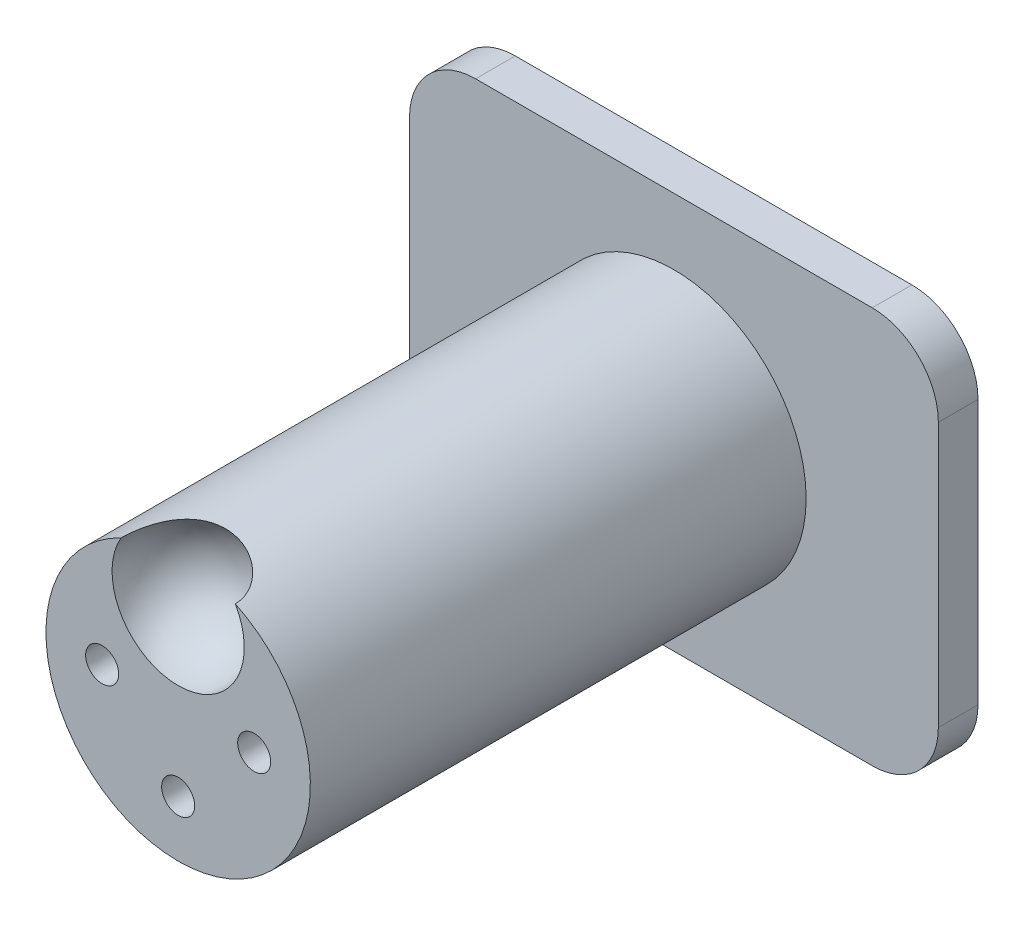
ISO-10303-21;
HEADER;
FILE_DESCRIPTION(('STEP AP214'),'2;1');
FILE_NAME('part.step','',(''),(''),'','','');
FILE_SCHEMA(('AUTOMOTIVE_DESIGN { 1 0 10303 214 1 1 1 1 }'));
ENDSEC;
DATA;
#1=APPLICATION_CONTEXT('core data for automotive mechanical design processes');
#2=APPLICATION_PROTOCOL_DEFINITION('international standard','automotive_design',2000,#1);
#3=PRODUCT_CONTEXT('',#1,'mechanical');
#4=PRODUCT('Part','Part','',(#3));
#5=PRODUCT_RELATED_PRODUCT_CATEGORY('part','',(#4));
#6=PRODUCT_DEFINITION_FORMATION('','',#4);
#7=PRODUCT_DEFINITION_CONTEXT('part definition',#1,'design');
#8=PRODUCT_DEFINITION('design','',#6,#7);
#9=PRODUCT_DEFINITION_SHAPE('','',#8);
#10=(LENGTH_UNIT() NAMED_UNIT(*) SI_UNIT(.MILLI.,.METRE.));
#11=(NAMED_UNIT(*) PLANE_ANGLE_UNIT() SI_UNIT($,.RADIAN.));
#12=(NAMED_UNIT(*) SI_UNIT($,.STERADIAN.) SOLID_ANGLE_UNIT());
#13=UNCERTAINTY_MEASURE_WITH_UNIT(LENGTH_MEASURE(1.E-05),#10,'distance_accuracy_value','');
#14=(GEOMETRIC_REPRESENTATION_CONTEXT(3) GLOBAL_UNCERTAINTY_ASSIGNED_CONTEXT((#13)) GLOBAL_UNIT_ASSIGNED_CONTEXT((#10,
#11,#12)) REPRESENTATION_CONTEXT('',''));
#15=CARTESIAN_POINT('',(0.,0.,0.));
#16=DIRECTION('',(0.,0.,1.));
#17=DIRECTION('',(1.,0.,0.));
#18=AXIS2_PLACEMENT_3D('',#15,#16,#17);
#19=CARTESIAN_POINT('',(0.,0.,6.));
#20=DIRECTION('',(0.,0.,1.));
#21=DIRECTION('',(1.,0.,0.));
#22=AXIS2_PLACEMENT_3D('',#19,#20,#21);
#23=PLANE('',#22);
#24=DIRECTION('',(0.,-1.,0.));
#25=VECTOR('',#24,1.);
#26=CARTESIAN_POINT('',(-49.9578316000514,-35.,6.));
#27=LINE('',#26,#25);
#28=CARTESIAN_POINT('',(-49.9578316000514,15.,6.));
#29=VERTEX_POINT('',#28);
#30=CARTESIAN_POINT('',(-49.9578316000514,-25.,6.));
#31=VERTEX_POINT('',#30);
#32=EDGE_CURVE('E132',#29,#31,#27,.T.);
#33=ORIENTED_EDGE('',*,*,#32,.T.);
#34=CARTESIAN_POINT('',(-39.9578316000514,-25.,6.));
#35=DIRECTION('',(0.,0.,1.));
#36=DIRECTION('',(1.,0.,0.));
#37=AXIS2_PLACEMENT_3D('',#34,#35,#36);
#38=CIRCLE('',#37,10.);
#39=CARTESIAN_POINT('',(-39.9578316000514,-35.,6.));
#40=VERTEX_POINT('',#39);
#41=EDGE_CURVE('E168',#31,#40,#38,.T.);
#42=ORIENTED_EDGE('',*,*,#41,.T.);
#43=DIRECTION('',(1.,0.,0.));
#44=VECTOR('',#43,1.);
#45=CARTESIAN_POINT('',(30.0421683999486,-35.,6.));
#46=LINE('',#45,#44);
#47=CARTESIAN_POINT('',(20.0421683999486,-35.,6.));
#48=VERTEX_POINT('',#47);
#49=EDGE_CURVE('E135',#40,#48,#46,.T.);
#50=ORIENTED_EDGE('',*,*,#49,.T.);
#51=CARTESIAN_POINT('',(20.0421683999486,-25.,6.));
#52=DIRECTION('',(0.,0.,1.));
#53=DIRECTION('',(1.,0.,0.));
#54=AXIS2_PLACEMENT_3D('',#51,#52,#53);
#55=CIRCLE('',#54,10.);
#56=CARTESIAN_POINT('',(30.0421683999486,-25.,6.));
#57=VERTEX_POINT('',#56);
#58=EDGE_CURVE('E166',#48,#57,#55,.T.);
#59=ORIENTED_EDGE('',*,*,#58,.T.);
#60=DIRECTION('',(0.,1.,0.));
#61=VECTOR('',#60,1.);
#62=CARTESIAN_POINT('',(30.0421683999486,-35.,6.));
#63=LINE('',#62,#61);
#64=CARTESIAN_POINT('',(30.0421683999486,15.,6.));
#65=VERTEX_POINT('',#64);
#66=EDGE_CURVE('E126',#57,#65,#63,.T.);
#67=ORIENTED_EDGE('',*,*,#66,.T.);
#68=CARTESIAN_POINT('',(20.0421683999486,15.,6.));
#69=DIRECTION('',(0.,0.,1.));
#70=DIRECTION('',(1.,0.,0.));
#71=AXIS2_PLACEMENT_3D('',#68,#69,#70);
#72=CIRCLE('',#71,10.);
#73=CARTESIAN_POINT('',(20.0421683999486,25.,6.));
#74=VERTEX_POINT('',#73);
#75=EDGE_CURVE('E162',#65,#74,#72,.T.);
#76=ORIENTED_EDGE('',*,*,#75,.T.);
#77=DIRECTION('',(-1.,0.,0.));
#78=VECTOR('',#77,1.);
#79=CARTESIAN_POINT('',(30.0421683999486,25.,6.));
#80=LINE('',#79,#78);
#81=CARTESIAN_POINT('',(-39.9578316000514,25.,6.));
#82=VERTEX_POINT('',#81);
#83=EDGE_CURVE('E129',#74,#82,#80,.T.);
#84=ORIENTED_EDGE('',*,*,#83,.T.);
#85=CARTESIAN_POINT('',(-39.9578316000514,15.,6.));
#86=DIRECTION('',(0.,0.,1.));
#87=DIRECTION('',(1.,0.,0.));
#88=AXIS2_PLACEMENT_3D('',#85,#86,#87);
#89=CIRCLE('',#88,10.);
#90=EDGE_CURVE('E164',#82,#29,#89,.T.);
#91=ORIENTED_EDGE('',*,*,#90,.T.);
#92=EDGE_LOOP('',(#33,#42,#50,#59,#67,#76,#84,#91));
#93=FACE_BOUND('',#92,.T.);
#94=CARTESIAN_POINT('',(-9.95783160005139,-5.,6.));
#95=DIRECTION('',(0.,0.,1.));
#96=DIRECTION('',(1.,0.,0.));
#97=AXIS2_PLACEMENT_3D('',#94,#95,#96);
#98=CIRCLE('',#97,20.);
#99=CARTESIAN_POINT('',(10.0421683999486,-5.,6.));
#100=VERTEX_POINT('',#99);
#101=EDGE_CURVE('E114',#100,#100,#98,.T.);
#102=ORIENTED_EDGE('',*,*,#101,.F.);
#103=EDGE_LOOP('',(#102));
#104=FACE_BOUND('',#103,.T.);
#105=ADVANCED_FACE('F33',(#93,#104),#23,.T.);
#106=CARTESIAN_POINT('',(30.0421683999486,-35.,6.));
#107=DIRECTION('',(-1.,0.,0.));
#108=DIRECTION('',(0.,0.,1.));
#109=AXIS2_PLACEMENT_3D('',#106,#107,#108);
#110=PLANE('',#109);
#111=ORIENTED_EDGE('',*,*,#66,.F.);
#112=DIRECTION('',(0.,0.,-1.));
#113=VECTOR('',#112,1.);
#114=CARTESIAN_POINT('',(30.0421683999486,-25.,6.));
#115=LINE('',#114,#113);
#116=CARTESIAN_POINT('',(30.0421683999486,-25.,0.));
#117=VERTEX_POINT('',#116);
#118=EDGE_CURVE('E172',#57,#117,#115,.T.);
#119=ORIENTED_EDGE('',*,*,#118,.T.);
#120=DIRECTION('',(0.,1.,0.));
#121=VECTOR('',#120,1.);
#122=CARTESIAN_POINT('',(30.0421683999486,-35.,0.));
#123=LINE('',#122,#121);
#124=CARTESIAN_POINT('',(30.0421683999486,15.,0.));
#125=VERTEX_POINT('',#124);
#126=EDGE_CURVE('E113',#117,#125,#123,.T.);
#127=ORIENTED_EDGE('',*,*,#126,.T.);
#128=DIRECTION('',(0.,0.,-1.));
#129=VECTOR('',#128,1.);
#130=CARTESIAN_POINT('',(30.0421683999486,15.,6.));
#131=LINE('',#130,#129);
#132=EDGE_CURVE('E170',#125,#65,#131,.F.);
#133=ORIENTED_EDGE('',*,*,#132,.T.);
#134=EDGE_LOOP('',(#111,#119,#127,#133));
#135=FACE_BOUND('',#134,.T.);
#136=ADVANCED_FACE('F211',(#135),#110,.F.);
#137=CARTESIAN_POINT('',(30.0421683999486,25.,6.));
#138=DIRECTION('',(0.,-1.,0.));
#139=DIRECTION('',(1.,0.,0.));
#140=AXIS2_PLACEMENT_3D('',#137,#138,#139);
#141=PLANE('',#140);
#142=DIRECTION('',(-1.,0.,0.));
#143=VECTOR('',#142,1.);
#144=CARTESIAN_POINT('',(30.0421683999486,25.,0.));
#145=LINE('',#144,#143);
#146=CARTESIAN_POINT('',(20.0421683999486,25.,0.));
#147=VERTEX_POINT('',#146);
#148=CARTESIAN_POINT('',(-39.9578316000514,25.,0.));
#149=VERTEX_POINT('',#148);
#150=EDGE_CURVE('E117',#147,#149,#145,.T.);
#151=ORIENTED_EDGE('',*,*,#150,.T.);
#152=DIRECTION('',(0.,0.,-1.));
#153=VECTOR('',#152,1.);
#154=CARTESIAN_POINT('',(-39.9578316000514,25.,6.));
#155=LINE('',#154,#153);
#156=EDGE_CURVE('E41',#149,#82,#155,.F.);
#157=ORIENTED_EDGE('',*,*,#156,.T.);
#158=ORIENTED_EDGE('',*,*,#83,.F.);
#159=DIRECTION('',(0.,0.,-1.));
#160=VECTOR('',#159,1.);
#161=CARTESIAN_POINT('',(20.0421683999486,25.,6.));
#162=LINE('',#161,#160);
#163=EDGE_CURVE('E175',#74,#147,#162,.T.);
#164=ORIENTED_EDGE('',*,*,#163,.T.);
#165=EDGE_LOOP('',(#151,#157,#158,#164));
#166=FACE_BOUND('',#165,.T.);
#167=ADVANCED_FACE('F179',(#166),#141,.F.);
#168=CARTESIAN_POINT('',(-49.9578316000514,-35.,6.));
#169=DIRECTION('',(1.,0.,0.));
#170=DIRECTION('',(0.,0.,-1.));
#171=AXIS2_PLACEMENT_3D('',#168,#169,#170);
#172=PLANE('',#171);
#173=DIRECTION('',(0.,-1.,0.));
#174=VECTOR('',#173,1.);
#175=CARTESIAN_POINT('',(-49.9578316000514,-35.,0.));
#176=LINE('',#175,#174);
#177=CARTESIAN_POINT('',(-49.9578316000514,15.,0.));
#178=VERTEX_POINT('',#177);
#179=CARTESIAN_POINT('',(-49.9578316000514,-25.,0.));
#180=VERTEX_POINT('',#179);
#181=EDGE_CURVE('E140',#178,#180,#176,.T.);
#182=ORIENTED_EDGE('',*,*,#181,.T.);
#183=DIRECTION('',(0.,0.,-1.));
#184=VECTOR('',#183,1.);
#185=CARTESIAN_POINT('',(-49.9578316000514,-25.,6.));
#186=LINE('',#185,#184);
#187=EDGE_CURVE('E160',#180,#31,#186,.F.);
#188=ORIENTED_EDGE('',*,*,#187,.T.);
#189=ORIENTED_EDGE('',*,*,#32,.F.);
#190=DIRECTION('',(0.,0.,-1.));
#191=VECTOR('',#190,1.);
#192=CARTESIAN_POINT('',(-49.9578316000514,15.,6.));
#193=LINE('',#192,#191);
#194=EDGE_CURVE('E157',#29,#178,#193,.T.);
#195=ORIENTED_EDGE('',*,*,#194,.T.);
#196=EDGE_LOOP('',(#182,#188,#189,#195));
#197=FACE_BOUND('',#196,.T.);
#198=ADVANCED_FACE('F193',(#197),#172,.F.);
#199=CARTESIAN_POINT('',(30.0421683999486,-35.,6.));
#200=DIRECTION('',(0.,1.,0.));
#201=DIRECTION('',(-1.,0.,0.));
#202=AXIS2_PLACEMENT_3D('',#199,#200,#201);
#203=PLANE('',#202);
#204=ORIENTED_EDGE('',*,*,#49,.F.);
#205=DIRECTION('',(0.,0.,-1.));
#206=VECTOR('',#205,1.);
#207=CARTESIAN_POINT('',(-39.9578316000514,-35.,6.));
#208=LINE('',#207,#206);
#209=CARTESIAN_POINT('',(-39.9578316000514,-35.,0.));
#210=VERTEX_POINT('',#209);
#211=EDGE_CURVE('E146',#40,#210,#208,.T.);
#212=ORIENTED_EDGE('',*,*,#211,.T.);
#213=DIRECTION('',(1.,0.,0.));
#214=VECTOR('',#213,1.);
#215=CARTESIAN_POINT('',(30.0421683999486,-35.,0.));
#216=LINE('',#215,#214);
#217=CARTESIAN_POINT('',(20.0421683999486,-35.,0.));
#218=VERTEX_POINT('',#217);
#219=EDGE_CURVE('E130',#210,#218,#216,.T.);
#220=ORIENTED_EDGE('',*,*,#219,.T.);
#221=DIRECTION('',(0.,0.,-1.));
#222=VECTOR('',#221,1.);
#223=CARTESIAN_POINT('',(20.0421683999486,-35.,6.));
#224=LINE('',#223,#222);
#225=EDGE_CURVE('E137',#218,#48,#224,.F.);
#226=ORIENTED_EDGE('',*,*,#225,.T.);
#227=EDGE_LOOP('',(#204,#212,#220,#226));
#228=FACE_BOUND('',#227,.T.);
#229=ADVANCED_FACE('F203',(#228),#203,.F.);
#230=CARTESIAN_POINT('',(0.,0.,0.));
#231=DIRECTION('',(0.,0.,1.));
#232=DIRECTION('',(1.,0.,0.));
#233=AXIS2_PLACEMENT_3D('',#230,#231,#232);
#234=PLANE('',#233);
#235=ORIENTED_EDGE('',*,*,#219,.F.);
#236=CARTESIAN_POINT('',(-39.9578316000514,-25.,0.));
#237=DIRECTION('',(0.,0.,1.));
#238=DIRECTION('',(1.,0.,0.));
#239=AXIS2_PLACEMENT_3D('',#236,#237,#238);
#240=CIRCLE('',#239,10.);
#241=EDGE_CURVE('E155',#210,#180,#240,.F.);
#242=ORIENTED_EDGE('',*,*,#241,.T.);
#243=ORIENTED_EDGE('',*,*,#181,.F.);
#244=CARTESIAN_POINT('',(-39.9578316000514,15.,0.));
#245=DIRECTION('',(0.,0.,1.));
#246=DIRECTION('',(1.,0.,0.));
#247=AXIS2_PLACEMENT_3D('',#244,#245,#246);
#248=CIRCLE('',#247,10.);
#249=EDGE_CURVE('E151',#178,#149,#248,.F.);
#250=ORIENTED_EDGE('',*,*,#249,.T.);
#251=ORIENTED_EDGE('',*,*,#150,.F.);
#252=CARTESIAN_POINT('',(20.0421683999486,15.,0.));
#253=DIRECTION('',(0.,0.,1.));
#254=DIRECTION('',(1.,0.,0.));
#255=AXIS2_PLACEMENT_3D('',#252,#253,#254);
#256=CIRCLE('',#255,10.);
#257=EDGE_CURVE('E149',#147,#125,#256,.F.);
#258=ORIENTED_EDGE('',*,*,#257,.T.);
#259=ORIENTED_EDGE('',*,*,#126,.F.);
#260=CARTESIAN_POINT('',(20.0421683999486,-25.,0.));
#261=DIRECTION('',(0.,0.,1.));
#262=DIRECTION('',(1.,0.,0.));
#263=AXIS2_PLACEMENT_3D('',#260,#261,#262);
#264=CIRCLE('',#263,10.);
#265=EDGE_CURVE('E153',#117,#218,#264,.F.);
#266=ORIENTED_EDGE('',*,*,#265,.T.);
#267=EDGE_LOOP('',(#235,#242,#243,#250,#251,#258,#259,#266));
#268=FACE_BOUND('',#267,.T.);
#269=ADVANCED_FACE('F184',(#268),#234,.F.);
#270=CARTESIAN_POINT('',(-9.95783160005139,-5.,81.));
#271=DIRECTION('',(0.,0.,-1.));
#272=DIRECTION('',(-1.,0.,0.));
#273=AXIS2_PLACEMENT_3D('',#270,#271,#272);
#274=CYLINDRICAL_SURFACE('',#273,20.);
#275=CARTESIAN_POINT('',(-9.95783160005139,-5.,81.));
#276=DIRECTION('',(0.,0.,1.));
#277=DIRECTION('',(1.,0.,0.));
#278=AXIS2_PLACEMENT_3D('',#275,#276,#277);
#279=CIRCLE('',#278,20.);
#280=CARTESIAN_POINT('',(-18.5957656890245,13.0384615384615,81.));
#281=VERTEX_POINT('',#280);
#282=CARTESIAN_POINT('',(-1.31989751107828,13.0384615384615,81.));
#283=VERTEX_POINT('',#282);
#284=EDGE_CURVE('E108',#281,#283,#279,.T.);
#285=ORIENTED_EDGE('',*,*,#284,.F.);
#286=CARTESIAN_POINT('',(-18.5957656858118,13.03846154,81.0002));
#287=CARTESIAN_POINT('',(-18.5958194261612,13.0384088876324,80.8176301358421));
#288=CARTESIAN_POINT('',(-18.5877484361733,13.0423000992443,80.6350890562003));
#289=CARTESIAN_POINT('',(-18.5557193538504,13.0575994662564,80.2718519671144));
#290=CARTESIAN_POINT('',(-18.5317727438403,13.0690021887846,80.0911547199265));
#291=CARTESIAN_POINT('',(-18.46859529565,13.0988407355018,79.7344873649878));
#292=CARTESIAN_POINT('',(-18.4294822316351,13.1172223431727,79.5584917388694));
#293=CARTESIAN_POINT('',(-18.3365894712036,13.160370373185,79.2112108681918));
#294=CARTESIAN_POINT('',(-18.2828080390031,13.1851375511449,79.0399261837451));
#295=CARTESIAN_POINT('',(-18.1615220009078,13.2401719548513,78.7037732576968));
#296=CARTESIAN_POINT('',(-18.094056209218,13.2704235992871,78.5388884055078));
#297=CARTESIAN_POINT('',(-17.9461496574339,13.3355748681974,78.2159309188068));
#298=CARTESIAN_POINT('',(-17.8657030776999,13.3704765761925,78.057861380253));
#299=CARTESIAN_POINT('',(-17.6926731449617,13.4439978770986,77.7491852361011));
#300=CARTESIAN_POINT('',(-17.6000762550616,13.4826216038433,77.5985872164464));
#301=CARTESIAN_POINT('',(-17.4037392810013,13.5625894106956,77.3055708485906));
#302=CARTESIAN_POINT('',(-17.2999948354673,13.6039345530619,77.1631557355616));
#303=CARTESIAN_POINT('',(-16.9673373376582,13.7329716883214,76.7411430842849));
#304=CARTESIAN_POINT('',(-16.7218247308537,13.8235487763619,76.4753003334698));
#305=CARTESIAN_POINT('',(-16.1951213848917,14.0045709566868,75.9820466730398));
#306=CARTESIAN_POINT('',(-15.9139271728562,14.0950160352549,75.7546395093781));
#307=CARTESIAN_POINT('',(-15.4424850530064,14.2341455506596,75.422993837292));
#308=CARTESIAN_POINT('',(-15.261531081201,14.2849068014069,75.3061744055309));
#309=CARTESIAN_POINT('',(-14.890578832197,14.383105284505,75.0862147949806));
#310=CARTESIAN_POINT('',(-14.7005796515428,14.4305421836376,74.9830759865541));
#311=CARTESIAN_POINT('',(-14.3127048653205,14.5211366814866,74.7904240648905));
#312=CARTESIAN_POINT('',(-14.1148252922161,14.5642920854335,74.7009179275458));
#313=CARTESIAN_POINT('',(-13.7124281481726,14.6454865401959,74.5355211064414));
#314=CARTESIAN_POINT('',(-13.5079100171116,14.6835251578872,74.4596315751149));
#315=CARTESIAN_POINT('',(-13.0649783283015,14.7586119046287,74.3119437285131));
#316=CARTESIAN_POINT('',(-12.8257574829266,14.7948115322718,74.2421277896061));
#317=CARTESIAN_POINT('',(-12.3418062633731,14.8589088563032,74.1199302759572));
#318=CARTESIAN_POINT('',(-12.0970754244312,14.8868058495278,74.0675501778409));
#319=CARTESIAN_POINT('',(-11.6036270434215,14.9337099399935,73.9801445984421));
#320=CARTESIAN_POINT('',(-11.3549084575052,14.9527146689281,73.9451237403567));
#321=CARTESIAN_POINT('',(-10.8551126047026,14.981430144763,73.8924071841464));
#322=CARTESIAN_POINT('',(-10.6040353026801,14.9911407529926,73.8747117445212));
#323=CARTESIAN_POINT('',(-10.0851154994406,15.0013831618722,73.8560470352191));
#324=CARTESIAN_POINT('',(-9.81721915773107,15.0012940953999,73.8562091473641));
#325=CARTESIAN_POINT('',(-9.2823625047952,14.9903801746893,73.8760979050308));
#326=CARTESIAN_POINT('',(-9.0154022432386,14.9795547591636,73.8958255734235));
#327=CARTESIAN_POINT('',(-8.48420406326268,14.9474119311848,73.9548893598652));
#328=CARTESIAN_POINT('',(-8.21996706694684,14.9260910768775,73.9942319104355));
#329=CARTESIAN_POINT('',(-7.69619279893093,14.8734563210459,74.0925921511112));
#330=CARTESIAN_POINT('',(-7.43665543893219,14.8421426074778,74.1516094711539));
#331=CARTESIAN_POINT('',(-6.92223783186849,14.7700059298632,74.2899347078282));
#332=CARTESIAN_POINT('',(-6.66740782928526,14.7291126517695,74.3693931073246));
#333=CARTESIAN_POINT('',(-6.16643000886042,14.6389930880622,74.5485008513994));
#334=CARTESIAN_POINT('',(-5.9202828183326,14.589766201848,74.6481516513402));
#335=CARTESIAN_POINT('',(-5.43887152285187,14.4843448712801,74.8677073768211));
#336=CARTESIAN_POINT('',(-5.20360263424318,14.4281535302859,74.9876032897125));
#337=CARTESIAN_POINT('',(-4.74603619726877,14.3104365098641,75.2477597804707));
#338=CARTESIAN_POINT('',(-4.52373562236321,14.2489120834694,75.3880155798854));
#339=CARTESIAN_POINT('',(-4.13750482180554,14.1351987297124,75.658688848966));
#340=CARTESIAN_POINT('',(-3.97081289312756,14.0836138292746,75.7854330306658));
#341=CARTESIAN_POINT('',(-3.64845073158019,13.9794727177815,76.0518655348456));
#342=CARTESIAN_POINT('',(-3.49277860200088,13.926916675851,76.1915516201835));
#343=CARTESIAN_POINT('',(-3.19390822338057,13.822178466678,76.4835919503343));
#344=CARTESIAN_POINT('',(-3.05070004956742,13.7699960328987,76.6359359234475));
#345=CARTESIAN_POINT('',(-2.77806469208348,13.6674089495916,76.9530558674581));
#346=CARTESIAN_POINT('',(-2.64863531405245,13.6170040178432,77.1178298516346));
#347=CARTESIAN_POINT('',(-2.42540840202565,13.527669963821,77.4307367556257));
#348=CARTESIAN_POINT('',(-2.32926939541967,13.4882296935293,77.5770564402104));
#349=CARTESIAN_POINT('',(-2.14851492723567,13.4126089930049,77.8774403932647));
#350=CARTESIAN_POINT('',(-2.06389732325082,13.3764279571417,78.0315032145818));
#351=CARTESIAN_POINT('',(-1.90719014939606,13.3083168950122,78.3465102706415));
#352=CARTESIAN_POINT('',(-1.83508318585757,13.2763809814035,78.5074445573809));
#353=CARTESIAN_POINT('',(-1.70415961064343,13.2176302364179,78.8354551268329));
#354=CARTESIAN_POINT('',(-1.64533562236817,13.190812563952,79.0025279403208));
#355=CARTESIAN_POINT('',(-1.54875117640676,13.1463439298861,79.3187950384542));
#356=CARTESIAN_POINT('',(-1.50921655007586,13.1279432272217,79.4673439190129));
#357=CARTESIAN_POINT('',(-1.4410721457492,13.0960276754116,79.767427891617));
#358=CARTESIAN_POINT('',(-1.41246049638479,13.0825119893662,79.9189624674587));
#359=CARTESIAN_POINT('',(-1.36638482958895,13.0606681911252,80.2248668926261));
#360=CARTESIAN_POINT('',(-1.34897696258672,13.0523662136261,80.379247094865));
#361=CARTESIAN_POINT('',(-1.32571523706444,13.0412470555497,80.6891466651436));
#362=CARTESIAN_POINT('',(-1.31986711077293,13.0384325961249,80.8446665599875));
#363=CARTESIAN_POINT('',(-1.31989751429102,13.03846154,81.0002));
#364=B_SPLINE_CURVE_WITH_KNOTS('',3,(#286,#287,#288,#289,#290,#291,#292,#293,#294,#295,#296,
#297,#298,#299,#300,#301,#302,#303,#304,#305,#306,#307,#308,#309,#310,#311,#312,#313,#314,#315,
#316,#317,#318,#319,#320,#321,#322,#323,#324,#325,#326,#327,#328,#329,#330,#331,#332,#333,#334,
#335,#336,#337,#338,#339,#340,#341,#342,#343,#344,#345,#346,#347,#348,#349,#350,#351,#352,#353,
#354,#355,#356,#357,#358,#359,#360,#361,#362,#363),.UNSPECIFIED.,.F.,.F.,(4,2,2,2,2,2,2,2,2,2,2,
2,2,2,2,2,2,2,2,2,2,2,2,2,2,2,2,2,2,2,2,2,2,2,2,2,2,2,4),(0.,0.547443834171983,1.09449215118353,
1.63737482997188,2.18032177877009,2.72174972767707,3.26342109133575,3.80570114850077,
4.34819414538649,5.46291979354796,6.57775402090519,7.24104528154342,7.90440293274831,
8.56809889449772,9.23185100127791,9.98647068851285,10.7411542675492,11.4960387297363,
12.2509344548212,13.0536831975525,13.8564739095307,14.6595280627216,15.4625671121183,
16.2716961398314,17.0808835060775,17.8897115862849,18.698350141077,19.3447250793084,
19.9909884926579,20.6367325004943,21.2823735151913,21.820244438746,22.3580152081171,
22.8950322114736,23.4317502490191,23.8957342540432,24.3596387317373,24.8258504364257,
25.2922932676029),.UNSPECIFIED.);
#365=EDGE_CURVE('E46',#281,#283,#364,.T.);
#366=ORIENTED_EDGE('',*,*,#365,.T.);
#367=EDGE_LOOP('',(#285,#366));
#368=FACE_BOUND('',#367,.T.);
#369=ORIENTED_EDGE('',*,*,#101,.T.);
#370=EDGE_LOOP('',(#369));
#371=FACE_BOUND('',#370,.T.);
#372=ADVANCED_FACE('F106',(#368,#371),#274,.T.);
#373=CARTESIAN_POINT('',(-9.95783160005139,-5.,81.));
#374=DIRECTION('',(0.,0.,1.));
#375=DIRECTION('',(1.,0.,0.));
#376=AXIS2_PLACEMENT_3D('',#373,#374,#375);
#377=PLANE('',#376);
#378=CARTESIAN_POINT('',(-9.95783160005139,7.99999999999999,81.));
#379=DIRECTION('',(0.,0.,1.));
#380=DIRECTION('',(1.,0.,0.));
#381=AXIS2_PLACEMENT_3D('',#378,#379,#380);
#382=CIRCLE('',#381,10.);
#383=EDGE_CURVE('E11',#281,#283,#382,.T.);
#384=ORIENTED_EDGE('',*,*,#383,.F.);
#385=ORIENTED_EDGE('',*,*,#284,.T.);
#386=EDGE_LOOP('',(#384,#385));
#387=FACE_BOUND('',#386,.T.);
#388=CARTESIAN_POINT('',(1.54216839994861,-5.,81.));
#389=DIRECTION('',(0.,0.,1.));
#390=DIRECTION('',(1.,0.,0.));
#391=AXIS2_PLACEMENT_3D('',#388,#389,#390);
#392=CIRCLE('',#391,2.5);
#393=CARTESIAN_POINT('',(4.04216839994861,-5.,81.));
#394=VERTEX_POINT('',#393);
#395=EDGE_CURVE('E109',#394,#394,#392,.T.);
#396=ORIENTED_EDGE('',*,*,#395,.F.);
#397=EDGE_LOOP('',(#396));
#398=FACE_BOUND('',#397,.T.);
#399=CARTESIAN_POINT('',(-21.4578316000514,-5.,81.));
#400=DIRECTION('',(0.,0.,1.));
#401=DIRECTION('',(1.,0.,0.));
#402=AXIS2_PLACEMENT_3D('',#399,#400,#401);
#403=CIRCLE('',#402,2.5);
#404=CARTESIAN_POINT('',(-18.9578316000514,-5.,81.));
#405=VERTEX_POINT('',#404);
#406=EDGE_CURVE('E384',#405,#405,#403,.T.);
#407=ORIENTED_EDGE('',*,*,#406,.F.);
#408=EDGE_LOOP('',(#407));
#409=FACE_BOUND('',#408,.T.);
#410=CARTESIAN_POINT('',(-9.95783160005139,-16.5,81.));
#411=DIRECTION('',(0.,0.,1.));
#412=DIRECTION('',(1.,0.,0.));
#413=AXIS2_PLACEMENT_3D('',#410,#411,#412);
#414=CIRCLE('',#413,2.5);
#415=CARTESIAN_POINT('',(-7.45783160005139,-16.5,81.));
#416=VERTEX_POINT('',#415);
#417=EDGE_CURVE('E123',#416,#416,#414,.T.);
#418=ORIENTED_EDGE('',*,*,#417,.F.);
#419=EDGE_LOOP('',(#418));
#420=FACE_BOUND('',#419,.T.);
#421=ADVANCED_FACE('F111',(#387,#398,#409,#420),#377,.T.);
#422=CARTESIAN_POINT('',(-9.95783160005139,-16.5,61.));
#423=DIRECTION('',(0.,0.,1.));
#424=DIRECTION('',(1.,0.,0.));
#425=AXIS2_PLACEMENT_3D('',#422,#423,#424);
#426=CYLINDRICAL_SURFACE('',#425,2.5);
#427=CARTESIAN_POINT('',(-9.95783160005139,-16.5,61.));
#428=DIRECTION('',(0.,0.,1.));
#429=DIRECTION('',(1.,0.,0.));
#430=AXIS2_PLACEMENT_3D('',#427,#428,#429);
#431=CIRCLE('',#430,2.5);
#432=CARTESIAN_POINT('',(-7.45783160005139,-16.5,61.));
#433=VERTEX_POINT('',#432);
#434=EDGE_CURVE('E120',#433,#433,#431,.T.);
#435=ORIENTED_EDGE('',*,*,#434,.F.);
#436=EDGE_LOOP('',(#435));
#437=FACE_BOUND('',#436,.T.);
#438=ORIENTED_EDGE('',*,*,#417,.T.);
#439=EDGE_LOOP('',(#438));
#440=FACE_BOUND('',#439,.T.);
#441=ADVANCED_FACE('F272',(#437,#440),#426,.F.);
#442=CARTESIAN_POINT('',(-9.95783160005139,-16.5,61.));
#443=DIRECTION('',(0.,0.,1.));
#444=DIRECTION('',(1.,0.,0.));
#445=AXIS2_PLACEMENT_3D('',#442,#443,#444);
#446=PLANE('',#445);
#447=ORIENTED_EDGE('',*,*,#434,.T.);
#448=EDGE_LOOP('',(#447));
#449=FACE_BOUND('',#448,.T.);
#450=ADVANCED_FACE('F285',(#449),#446,.T.);
#451=CARTESIAN_POINT('',(-21.4578316000514,-5.,61.));
#452=DIRECTION('',(0.,0.,1.));
#453=DIRECTION('',(1.,0.,0.));
#454=AXIS2_PLACEMENT_3D('',#451,#452,#453);
#455=CYLINDRICAL_SURFACE('',#454,2.5);
#456=CARTESIAN_POINT('',(-21.4578316000514,-5.,61.));
#457=DIRECTION('',(0.,0.,1.));
#458=DIRECTION('',(1.,0.,0.));
#459=AXIS2_PLACEMENT_3D('',#456,#457,#458);
#460=CIRCLE('',#459,2.5);
#461=CARTESIAN_POINT('',(-18.9578316000514,-5.,61.));
#462=VERTEX_POINT('',#461);
#463=EDGE_CURVE('E387',#462,#462,#460,.T.);
#464=ORIENTED_EDGE('',*,*,#463,.F.);
#465=EDGE_LOOP('',(#464));
#466=FACE_BOUND('',#465,.T.);
#467=ORIENTED_EDGE('',*,*,#406,.T.);
#468=EDGE_LOOP('',(#467));
#469=FACE_BOUND('',#468,.T.);
#470=ADVANCED_FACE('F292',(#466,#469),#455,.F.);
#471=CARTESIAN_POINT('',(-21.4578316000514,-5.,61.));
#472=DIRECTION('',(0.,0.,1.));
#473=DIRECTION('',(1.,0.,0.));
#474=AXIS2_PLACEMENT_3D('',#471,#472,#473);
#475=PLANE('',#474);
#476=ORIENTED_EDGE('',*,*,#463,.T.);
#477=EDGE_LOOP('',(#476));
#478=FACE_BOUND('',#477,.T.);
#479=ADVANCED_FACE('F300',(#478),#475,.T.);
#480=CARTESIAN_POINT('',(1.54216839994861,-5.,61.));
#481=DIRECTION('',(0.,0.,1.));
#482=DIRECTION('',(1.,0.,0.));
#483=AXIS2_PLACEMENT_3D('',#480,#481,#482);
#484=CYLINDRICAL_SURFACE('',#483,2.5);
#485=CARTESIAN_POINT('',(1.54216839994861,-5.,61.));
#486=DIRECTION('',(0.,0.,1.));
#487=DIRECTION('',(1.,0.,0.));
#488=AXIS2_PLACEMENT_3D('',#485,#486,#487);
#489=CIRCLE('',#488,2.5);
#490=CARTESIAN_POINT('',(4.04216839994861,-5.,61.));
#491=VERTEX_POINT('',#490);
#492=EDGE_CURVE('E382',#491,#491,#489,.T.);
#493=ORIENTED_EDGE('',*,*,#492,.F.);
#494=EDGE_LOOP('',(#493));
#495=FACE_BOUND('',#494,.T.);
#496=ORIENTED_EDGE('',*,*,#395,.T.);
#497=EDGE_LOOP('',(#496));
#498=FACE_BOUND('',#497,.T.);
#499=ADVANCED_FACE('F308',(#495,#498),#484,.F.);
#500=CARTESIAN_POINT('',(1.54216839994861,-5.,61.));
#501=DIRECTION('',(0.,0.,1.));
#502=DIRECTION('',(1.,0.,0.));
#503=AXIS2_PLACEMENT_3D('',#500,#501,#502);
#504=PLANE('',#503);
#505=ORIENTED_EDGE('',*,*,#492,.T.);
#506=EDGE_LOOP('',(#505));
#507=FACE_BOUND('',#506,.T.);
#508=ADVANCED_FACE('F239',(#507),#504,.T.);
#509=CARTESIAN_POINT('',(-39.9578316000514,-25.,6.));
#510=DIRECTION('',(0.,0.,-1.));
#511=DIRECTION('',(-1.,0.,0.));
#512=AXIS2_PLACEMENT_3D('',#509,#510,#511);
#513=CYLINDRICAL_SURFACE('',#512,10.);
#514=ORIENTED_EDGE('',*,*,#41,.F.);
#515=ORIENTED_EDGE('',*,*,#187,.F.);
#516=ORIENTED_EDGE('',*,*,#241,.F.);
#517=ORIENTED_EDGE('',*,*,#211,.F.);
#518=EDGE_LOOP('',(#514,#515,#516,#517));
#519=FACE_BOUND('',#518,.T.);
#520=ADVANCED_FACE('F201',(#519),#513,.T.);
#521=CARTESIAN_POINT('',(20.0421683999486,-25.,6.));
#522=DIRECTION('',(0.,0.,-1.));
#523=DIRECTION('',(-1.,0.,0.));
#524=AXIS2_PLACEMENT_3D('',#521,#522,#523);
#525=CYLINDRICAL_SURFACE('',#524,10.);
#526=ORIENTED_EDGE('',*,*,#58,.F.);
#527=ORIENTED_EDGE('',*,*,#225,.F.);
#528=ORIENTED_EDGE('',*,*,#265,.F.);
#529=ORIENTED_EDGE('',*,*,#118,.F.);
#530=EDGE_LOOP('',(#526,#527,#528,#529));
#531=FACE_BOUND('',#530,.T.);
#532=ADVANCED_FACE('F208',(#531),#525,.T.);
#533=CARTESIAN_POINT('',(-39.9578316000514,15.,6.));
#534=DIRECTION('',(0.,0.,-1.));
#535=DIRECTION('',(-1.,0.,0.));
#536=AXIS2_PLACEMENT_3D('',#533,#534,#535);
#537=CYLINDRICAL_SURFACE('',#536,10.);
#538=ORIENTED_EDGE('',*,*,#90,.F.);
#539=ORIENTED_EDGE('',*,*,#156,.F.);
#540=ORIENTED_EDGE('',*,*,#249,.F.);
#541=ORIENTED_EDGE('',*,*,#194,.F.);
#542=EDGE_LOOP('',(#538,#539,#540,#541));
#543=FACE_BOUND('',#542,.T.);
#544=ADVANCED_FACE('F190',(#543),#537,.T.);
#545=CARTESIAN_POINT('',(20.0421683999486,15.,6.));
#546=DIRECTION('',(0.,0.,-1.));
#547=DIRECTION('',(-1.,0.,0.));
#548=AXIS2_PLACEMENT_3D('',#545,#546,#547);
#549=CYLINDRICAL_SURFACE('',#548,10.);
#550=ORIENTED_EDGE('',*,*,#75,.F.);
#551=ORIENTED_EDGE('',*,*,#132,.F.);
#552=ORIENTED_EDGE('',*,*,#257,.F.);
#553=ORIENTED_EDGE('',*,*,#163,.F.);
#554=EDGE_LOOP('',(#550,#551,#552,#553));
#555=FACE_BOUND('',#554,.T.);
#556=ADVANCED_FACE('F35',(#555),#549,.T.);
#557=CARTESIAN_POINT('',(-9.95783160005139,7.99999999999999,81.));
#558=DIRECTION('',(0.,-1.,0.));
#559=DIRECTION('',(1.,0.,0.));
#560=AXIS2_PLACEMENT_3D('',#557,#558,#559);
#561=SPHERICAL_SURFACE('',#560,10.);
#562=ORIENTED_EDGE('',*,*,#383,.T.);
#563=ORIENTED_EDGE('',*,*,#365,.F.);
#564=EDGE_LOOP('',(#562,#563));
#565=FACE_BOUND('',#564,.T.);
#566=ADVANCED_FACE('F101',(#565),#561,.F.);
#567=CLOSED_SHELL('',(#105,#136,#167,#198,#229,#269,#372,#421,#441,#450,#470,#479,#499,#508,
#520,#532,#544,#556,#566));
#568=MANIFOLD_SOLID_BREP('B2',#567);
#569=ADVANCED_BREP_SHAPE_REPRESENTATION('',(#18,#568),#14);
#570=SHAPE_DEFINITION_REPRESENTATION(#9,#569);
ENDSEC;
END-ISO-10303-21;
